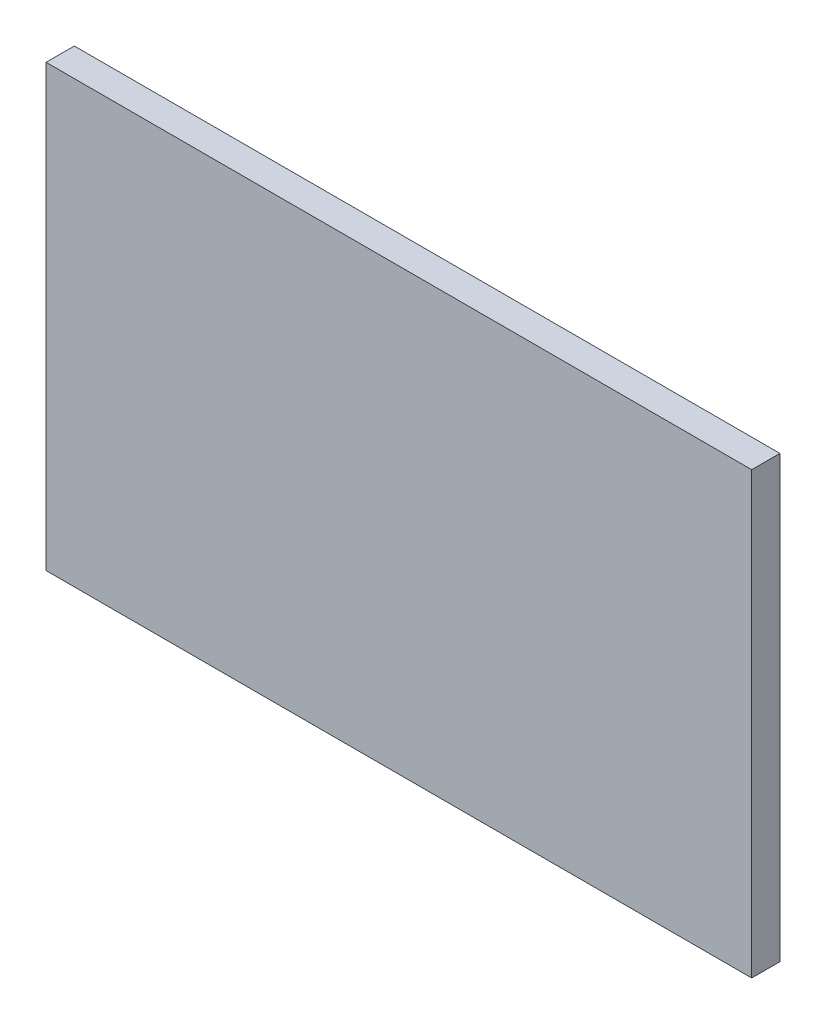
ISO-10303-21;
HEADER;
FILE_DESCRIPTION(('STEP AP214'),'2;1');
FILE_NAME('part.step','',(''),(''),'','','');
FILE_SCHEMA(('AUTOMOTIVE_DESIGN { 1 0 10303 214 1 1 1 1 }'));
ENDSEC;
DATA;
#1=APPLICATION_CONTEXT('core data for automotive mechanical design processes');
#2=APPLICATION_PROTOCOL_DEFINITION('international standard','automotive_design',2000,#1);
#3=PRODUCT_CONTEXT('',#1,'mechanical');
#4=PRODUCT('Part','Part','',(#3));
#5=PRODUCT_RELATED_PRODUCT_CATEGORY('part','',(#4));
#6=PRODUCT_DEFINITION_FORMATION('','',#4);
#7=PRODUCT_DEFINITION_CONTEXT('part definition',#1,'design');
#8=PRODUCT_DEFINITION('design','',#6,#7);
#9=PRODUCT_DEFINITION_SHAPE('','',#8);
#10=(LENGTH_UNIT() NAMED_UNIT(*) SI_UNIT(.MILLI.,.METRE.));
#11=(NAMED_UNIT(*) PLANE_ANGLE_UNIT() SI_UNIT($,.RADIAN.));
#12=(NAMED_UNIT(*) SI_UNIT($,.STERADIAN.) SOLID_ANGLE_UNIT());
#13=UNCERTAINTY_MEASURE_WITH_UNIT(LENGTH_MEASURE(1.E-05),#10,'distance_accuracy_value','');
#14=(GEOMETRIC_REPRESENTATION_CONTEXT(3) GLOBAL_UNCERTAINTY_ASSIGNED_CONTEXT((#13)) GLOBAL_UNIT_ASSIGNED_CONTEXT((#10,
#11,#12)) REPRESENTATION_CONTEXT('',''));
#15=CARTESIAN_POINT('',(0.,0.,0.));
#16=DIRECTION('',(0.,0.,1.));
#17=DIRECTION('',(1.,0.,0.));
#18=AXIS2_PLACEMENT_3D('',#15,#16,#17);
#19=CARTESIAN_POINT('',(2.93917666837465,73.2166491595706,114.516306215624));
#20=DIRECTION('',(1.,0.,0.));
#21=DIRECTION('',(0.,0.,-1.));
#22=AXIS2_PLACEMENT_3D('',#19,#20,#21);
#23=PLANE('',#22);
#24=DIRECTION('',(0.,-1.,0.));
#25=VECTOR('',#24,1.);
#26=CARTESIAN_POINT('',(2.93917666837465,73.2166491595706,110.516306215624));
#27=LINE('',#26,#25);
#28=CARTESIAN_POINT('',(2.93917666837465,73.2166491595706,110.516306215624));
#29=VERTEX_POINT('',#28);
#30=CARTESIAN_POINT('',(2.93917666837465,10.831270622861,110.516306215624));
#31=VERTEX_POINT('',#30);
#32=EDGE_CURVE('E96',#29,#31,#27,.T.);
#33=ORIENTED_EDGE('',*,*,#32,.T.);
#34=DIRECTION('',(0.,0.,-1.));
#35=VECTOR('',#34,1.);
#36=CARTESIAN_POINT('',(2.93917666837465,10.831270622861,114.516306215624));
#37=LINE('',#36,#35);
#38=CARTESIAN_POINT('',(2.93917666837465,10.831270622861,114.516306215624));
#39=VERTEX_POINT('',#38);
#40=EDGE_CURVE('E11',#39,#31,#37,.T.);
#41=ORIENTED_EDGE('',*,*,#40,.F.);
#42=DIRECTION('',(0.,-1.,0.));
#43=VECTOR('',#42,1.);
#44=CARTESIAN_POINT('',(2.93917666837465,73.2166491595706,114.516306215624));
#45=LINE('',#44,#43);
#46=CARTESIAN_POINT('',(2.93917666837465,73.2166491595706,114.516306215624));
#47=VERTEX_POINT('',#46);
#48=EDGE_CURVE('E84',#47,#39,#45,.T.);
#49=ORIENTED_EDGE('',*,*,#48,.F.);
#50=DIRECTION('',(0.,0.,-1.));
#51=VECTOR('',#50,1.);
#52=CARTESIAN_POINT('',(2.93917666837465,73.2166491595706,114.516306215624));
#53=LINE('',#52,#51);
#54=EDGE_CURVE('E92',#47,#29,#53,.T.);
#55=ORIENTED_EDGE('',*,*,#54,.T.);
#56=EDGE_LOOP('',(#33,#41,#49,#55));
#57=FACE_BOUND('',#56,.T.);
#58=ADVANCED_FACE('F33',(#57),#23,.F.);
#59=CARTESIAN_POINT('',(2.93917666837465,10.831270622861,114.516306215624));
#60=DIRECTION('',(0.,1.,0.));
#61=DIRECTION('',(0.,0.,1.));
#62=AXIS2_PLACEMENT_3D('',#59,#60,#61);
#63=PLANE('',#62);
#64=DIRECTION('',(1.,0.,0.));
#65=VECTOR('',#64,1.);
#66=CARTESIAN_POINT('',(2.93917666837465,10.831270622861,110.516306215624));
#67=LINE('',#66,#65);
#68=CARTESIAN_POINT('',(102.939176668375,10.831270622861,110.516306215624));
#69=VERTEX_POINT('',#68);
#70=EDGE_CURVE('E88',#31,#69,#67,.T.);
#71=ORIENTED_EDGE('',*,*,#70,.T.);
#72=DIRECTION('',(0.,0.,-1.));
#73=VECTOR('',#72,1.);
#74=CARTESIAN_POINT('',(102.939176668375,10.831270622861,114.516306215624));
#75=LINE('',#74,#73);
#76=CARTESIAN_POINT('',(102.939176668375,10.831270622861,114.516306215624));
#77=VERTEX_POINT('',#76);
#78=EDGE_CURVE('E41',#77,#69,#75,.T.);
#79=ORIENTED_EDGE('',*,*,#78,.F.);
#80=DIRECTION('',(1.,0.,0.));
#81=VECTOR('',#80,1.);
#82=CARTESIAN_POINT('',(2.93917666837465,10.831270622861,114.516306215624));
#83=LINE('',#82,#81);
#84=EDGE_CURVE('E79',#39,#77,#83,.T.);
#85=ORIENTED_EDGE('',*,*,#84,.F.);
#86=ORIENTED_EDGE('',*,*,#40,.T.);
#87=EDGE_LOOP('',(#71,#79,#85,#86));
#88=FACE_BOUND('',#87,.T.);
#89=ADVANCED_FACE('F87',(#88),#63,.F.);
#90=CARTESIAN_POINT('',(102.939176668375,73.2166491595706,114.516306215624));
#91=DIRECTION('',(-1.,0.,0.));
#92=DIRECTION('',(0.,0.,1.));
#93=AXIS2_PLACEMENT_3D('',#90,#91,#92);
#94=PLANE('',#93);
#95=DIRECTION('',(0.,1.,0.));
#96=VECTOR('',#95,1.);
#97=CARTESIAN_POINT('',(102.939176668375,73.2166491595706,110.516306215624));
#98=LINE('',#97,#96);
#99=CARTESIAN_POINT('',(102.939176668375,73.2166491595706,110.516306215624));
#100=VERTEX_POINT('',#99);
#101=EDGE_CURVE('E66',#69,#100,#98,.T.);
#102=ORIENTED_EDGE('',*,*,#101,.T.);
#103=DIRECTION('',(0.,0.,-1.));
#104=VECTOR('',#103,1.);
#105=CARTESIAN_POINT('',(102.939176668375,73.2166491595706,114.516306215624));
#106=LINE('',#105,#104);
#107=CARTESIAN_POINT('',(102.939176668375,73.2166491595706,114.516306215624));
#108=VERTEX_POINT('',#107);
#109=EDGE_CURVE('E89',#108,#100,#106,.T.);
#110=ORIENTED_EDGE('',*,*,#109,.F.);
#111=DIRECTION('',(0.,1.,0.));
#112=VECTOR('',#111,1.);
#113=CARTESIAN_POINT('',(102.939176668375,73.2166491595706,114.516306215624));
#114=LINE('',#113,#112);
#115=EDGE_CURVE('E82',#77,#108,#114,.T.);
#116=ORIENTED_EDGE('',*,*,#115,.F.);
#117=ORIENTED_EDGE('',*,*,#78,.T.);
#118=EDGE_LOOP('',(#102,#110,#116,#117));
#119=FACE_BOUND('',#118,.T.);
#120=ADVANCED_FACE('F90',(#119),#94,.F.);
#121=CARTESIAN_POINT('',(2.93917666837465,73.2166491595706,114.516306215624));
#122=DIRECTION('',(0.,-1.,0.));
#123=DIRECTION('',(0.,0.,-1.));
#124=AXIS2_PLACEMENT_3D('',#121,#122,#123);
#125=PLANE('',#124);
#126=DIRECTION('',(-1.,0.,0.));
#127=VECTOR('',#126,1.);
#128=CARTESIAN_POINT('',(2.93917666837465,73.2166491595706,110.516306215624));
#129=LINE('',#128,#127);
#130=EDGE_CURVE('E72',#100,#29,#129,.T.);
#131=ORIENTED_EDGE('',*,*,#130,.T.);
#132=ORIENTED_EDGE('',*,*,#54,.F.);
#133=DIRECTION('',(-1.,0.,0.));
#134=VECTOR('',#133,1.);
#135=CARTESIAN_POINT('',(2.93917666837465,73.2166491595706,114.516306215624));
#136=LINE('',#135,#134);
#137=EDGE_CURVE('E49',#108,#47,#136,.T.);
#138=ORIENTED_EDGE('',*,*,#137,.F.);
#139=ORIENTED_EDGE('',*,*,#109,.T.);
#140=EDGE_LOOP('',(#131,#132,#138,#139));
#141=FACE_BOUND('',#140,.T.);
#142=ADVANCED_FACE('F103',(#141),#125,.F.);
#143=CARTESIAN_POINT('',(0.,0.,114.516306215624));
#144=DIRECTION('',(0.,0.,1.));
#145=DIRECTION('',(1.,0.,0.));
#146=AXIS2_PLACEMENT_3D('',#143,#144,#145);
#147=PLANE('',#146);
#148=ORIENTED_EDGE('',*,*,#48,.T.);
#149=ORIENTED_EDGE('',*,*,#84,.T.);
#150=ORIENTED_EDGE('',*,*,#115,.T.);
#151=ORIENTED_EDGE('',*,*,#137,.T.);
#152=EDGE_LOOP('',(#148,#149,#150,#151));
#153=FACE_BOUND('',#152,.T.);
#154=ADVANCED_FACE('F80',(#153),#147,.T.);
#155=CARTESIAN_POINT('',(0.,0.,110.516306215624));
#156=DIRECTION('',(0.,0.,1.));
#157=DIRECTION('',(1.,0.,0.));
#158=AXIS2_PLACEMENT_3D('',#155,#156,#157);
#159=PLANE('',#158);
#160=ORIENTED_EDGE('',*,*,#32,.F.);
#161=ORIENTED_EDGE('',*,*,#130,.F.);
#162=ORIENTED_EDGE('',*,*,#101,.F.);
#163=ORIENTED_EDGE('',*,*,#70,.F.);
#164=EDGE_LOOP('',(#160,#161,#162,#163));
#165=FACE_BOUND('',#164,.T.);
#166=ADVANCED_FACE('F106',(#165),#159,.F.);
#167=CLOSED_SHELL('',(#58,#89,#120,#142,#154,#166));
#168=MANIFOLD_SOLID_BREP('B2',#167);
#169=ADVANCED_BREP_SHAPE_REPRESENTATION('',(#18,#168),#14);
#170=SHAPE_DEFINITION_REPRESENTATION(#9,#169);
ENDSEC;
END-ISO-10303-21;
